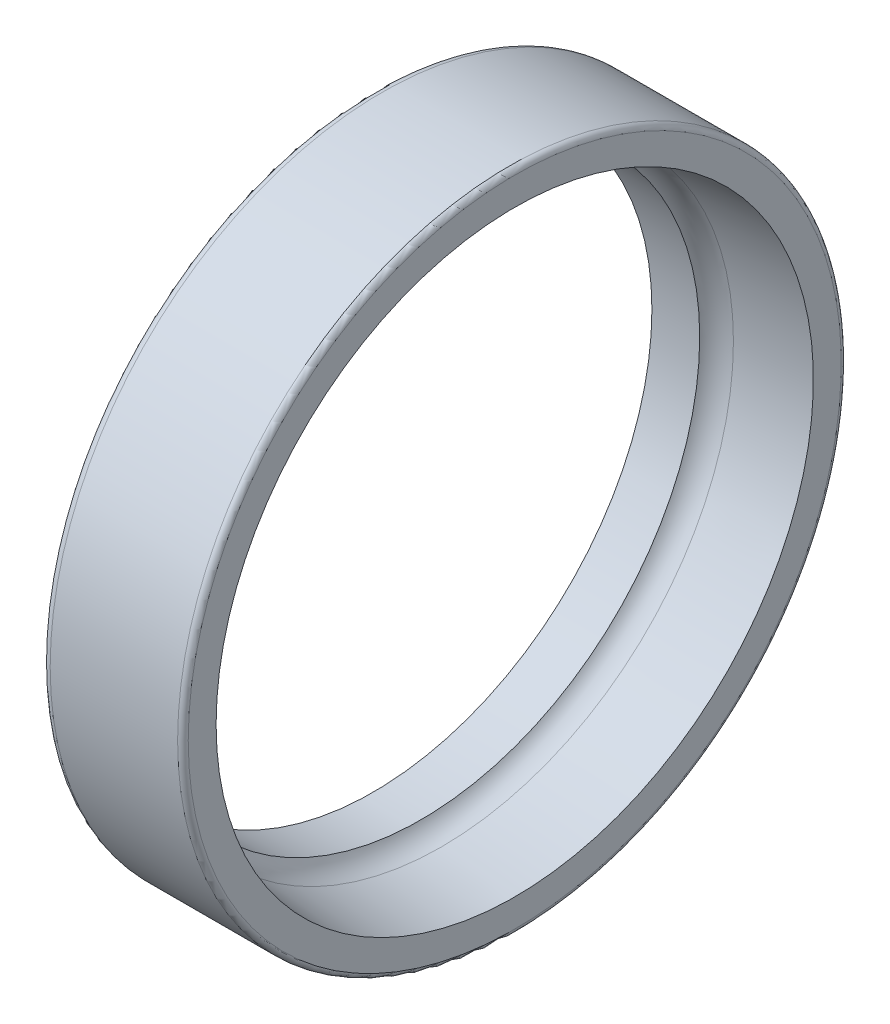
ISO-10303-21;
HEADER;
FILE_DESCRIPTION(('STEP AP214'),'2;1');
FILE_NAME('part.step','',(''),(''),'','','');
FILE_SCHEMA(('AUTOMOTIVE_DESIGN { 1 0 10303 214 1 1 1 1 }'));
ENDSEC;
DATA;
#1=APPLICATION_CONTEXT('core data for automotive mechanical design processes');
#2=APPLICATION_PROTOCOL_DEFINITION('international standard','automotive_design',2000,#1);
#3=PRODUCT_CONTEXT('',#1,'mechanical');
#4=PRODUCT('Part','Part','',(#3));
#5=PRODUCT_RELATED_PRODUCT_CATEGORY('part','',(#4));
#6=PRODUCT_DEFINITION_FORMATION('','',#4);
#7=PRODUCT_DEFINITION_CONTEXT('part definition',#1,'design');
#8=PRODUCT_DEFINITION('design','',#6,#7);
#9=PRODUCT_DEFINITION_SHAPE('','',#8);
#10=(LENGTH_UNIT() NAMED_UNIT(*) SI_UNIT(.MILLI.,.METRE.));
#11=(NAMED_UNIT(*) PLANE_ANGLE_UNIT() SI_UNIT($,.RADIAN.));
#12=(NAMED_UNIT(*) SI_UNIT($,.STERADIAN.) SOLID_ANGLE_UNIT());
#13=UNCERTAINTY_MEASURE_WITH_UNIT(LENGTH_MEASURE(1.E-05),#10,'distance_accuracy_value','');
#14=(GEOMETRIC_REPRESENTATION_CONTEXT(3) GLOBAL_UNCERTAINTY_ASSIGNED_CONTEXT((#13)) GLOBAL_UNIT_ASSIGNED_CONTEXT((#10,
#11,#12)) REPRESENTATION_CONTEXT('',''));
#15=CARTESIAN_POINT('',(0.,0.,0.));
#16=DIRECTION('',(0.,0.,1.));
#17=DIRECTION('',(1.,0.,0.));
#18=AXIS2_PLACEMENT_3D('',#15,#16,#17);
#19=CARTESIAN_POINT('',(0.,36.5,0.));
#20=DIRECTION('',(1.,0.,0.));
#21=DIRECTION('',(0.,0.,-1.));
#22=AXIS2_PLACEMENT_3D('',#19,#20,#21);
#23=PLANE('',#22);
#24=CARTESIAN_POINT('',(0.,0.,0.));
#25=DIRECTION('',(-1.,0.,0.));
#26=DIRECTION('',(0.,0.,1.));
#27=AXIS2_PLACEMENT_3D('',#24,#25,#26);
#28=CIRCLE('',#27,31.5);
#29=CARTESIAN_POINT('',(0.,0.,31.5));
#30=VERTEX_POINT('',#29);
#31=EDGE_CURVE('E59',#30,#30,#28,.T.);
#32=ORIENTED_EDGE('',*,*,#31,.F.);
#33=EDGE_LOOP('',(#32));
#34=FACE_BOUND('',#33,.T.);
#35=CARTESIAN_POINT('',(0.,0.,0.));
#36=DIRECTION('',(-1.,0.,0.));
#37=DIRECTION('',(0.,0.,1.));
#38=AXIS2_PLACEMENT_3D('',#35,#36,#37);
#39=CIRCLE('',#38,36.5);
#40=CARTESIAN_POINT('',(0.,0.,36.5));
#41=VERTEX_POINT('',#40);
#42=EDGE_CURVE('E10',#41,#41,#39,.T.);
#43=ORIENTED_EDGE('',*,*,#42,.T.);
#44=EDGE_LOOP('',(#43));
#45=FACE_BOUND('',#44,.T.);
#46=ADVANCED_FACE('F31',(#34,#45),#23,.F.);
#47=CARTESIAN_POINT('',(0.99999999999922,0.,0.));
#48=DIRECTION('',(-1.,0.,0.));
#49=DIRECTION('',(0.,0.,1.));
#50=AXIS2_PLACEMENT_3D('',#47,#48,#49);
#51=TOROIDAL_SURFACE('',#50,36.5000000000008,0.999999999999219);
#52=ORIENTED_EDGE('',*,*,#42,.F.);
#53=EDGE_LOOP('',(#52));
#54=FACE_BOUND('',#53,.T.);
#55=CARTESIAN_POINT('',(1.,0.,0.));
#56=DIRECTION('',(-1.,0.,0.));
#57=DIRECTION('',(0.,0.,1.));
#58=AXIS2_PLACEMENT_3D('',#55,#56,#57);
#59=CIRCLE('',#58,37.5);
#60=CARTESIAN_POINT('',(1.,0.,37.5));
#61=VERTEX_POINT('',#60);
#62=EDGE_CURVE('E37',#61,#61,#59,.T.);
#63=ORIENTED_EDGE('',*,*,#62,.T.);
#64=EDGE_LOOP('',(#63));
#65=FACE_BOUND('',#64,.T.);
#66=ADVANCED_FACE('F66',(#54,#65),#51,.T.);
#67=CARTESIAN_POINT('',(16.,0.,0.));
#68=DIRECTION('',(-1.,0.,0.));
#69=DIRECTION('',(0.,0.,1.));
#70=AXIS2_PLACEMENT_3D('',#67,#68,#69);
#71=CYLINDRICAL_SURFACE('',#70,37.5);
#72=ORIENTED_EDGE('',*,*,#62,.F.);
#73=EDGE_LOOP('',(#72));
#74=FACE_BOUND('',#73,.T.);
#75=CARTESIAN_POINT('',(15.4,0.,0.));
#76=DIRECTION('',(-1.,0.,0.));
#77=DIRECTION('',(0.,0.,1.));
#78=AXIS2_PLACEMENT_3D('',#75,#76,#77);
#79=CIRCLE('',#78,37.5);
#80=CARTESIAN_POINT('',(15.4,0.,37.5));
#81=VERTEX_POINT('',#80);
#82=EDGE_CURVE('E41',#81,#81,#79,.T.);
#83=ORIENTED_EDGE('',*,*,#82,.T.);
#84=EDGE_LOOP('',(#83));
#85=FACE_BOUND('',#84,.T.);
#86=ADVANCED_FACE('F70',(#74,#85),#71,.T.);
#87=CARTESIAN_POINT('',(15.4000000000002,0.,0.));
#88=DIRECTION('',(-1.,0.,0.));
#89=DIRECTION('',(0.,0.,1.));
#90=AXIS2_PLACEMENT_3D('',#87,#88,#89);
#91=TOROIDAL_SURFACE('',#90,36.9000000000002,0.599999999999765);
#92=ORIENTED_EDGE('',*,*,#82,.F.);
#93=EDGE_LOOP('',(#92));
#94=FACE_BOUND('',#93,.T.);
#95=CARTESIAN_POINT('',(16.,0.,0.));
#96=DIRECTION('',(-1.,0.,0.));
#97=DIRECTION('',(0.,0.,1.));
#98=AXIS2_PLACEMENT_3D('',#95,#96,#97);
#99=CIRCLE('',#98,36.9);
#100=CARTESIAN_POINT('',(16.,0.,36.9));
#101=VERTEX_POINT('',#100);
#102=EDGE_CURVE('E45',#101,#101,#99,.T.);
#103=ORIENTED_EDGE('',*,*,#102,.T.);
#104=EDGE_LOOP('',(#103));
#105=FACE_BOUND('',#104,.T.);
#106=ADVANCED_FACE('F75',(#94,#105),#91,.T.);
#107=CARTESIAN_POINT('',(16.,33.75,0.));
#108=DIRECTION('',(-1.,0.,0.));
#109=DIRECTION('',(0.,0.,1.));
#110=AXIS2_PLACEMENT_3D('',#107,#108,#109);
#111=PLANE('',#110);
#112=ORIENTED_EDGE('',*,*,#102,.F.);
#113=EDGE_LOOP('',(#112));
#114=FACE_BOUND('',#113,.T.);
#115=CARTESIAN_POINT('',(16.,0.,0.));
#116=DIRECTION('',(-1.,0.,0.));
#117=DIRECTION('',(0.,0.,1.));
#118=AXIS2_PLACEMENT_3D('',#115,#116,#117);
#119=CIRCLE('',#118,33.75);
#120=CARTESIAN_POINT('',(16.,0.,33.75));
#121=VERTEX_POINT('',#120);
#122=EDGE_CURVE('E50',#121,#121,#119,.T.);
#123=ORIENTED_EDGE('',*,*,#122,.T.);
#124=EDGE_LOOP('',(#123));
#125=FACE_BOUND('',#124,.T.);
#126=ADVANCED_FACE('F81',(#114,#125),#111,.F.);
#127=CARTESIAN_POINT('',(7.7246842974592,0.,0.));
#128=DIRECTION('',(1.,0.,0.));
#129=DIRECTION('',(0.,0.,-1.));
#130=AXIS2_PLACEMENT_3D('',#127,#128,#129);
#131=CONICAL_SURFACE('',#130,32.98734016542,0.0919012099313217);
#132=ORIENTED_EDGE('',*,*,#122,.F.);
#133=EDGE_LOOP('',(#132));
#134=FACE_BOUND('',#133,.T.);
#135=CARTESIAN_POINT('',(7.7246842974592,0.,0.));
#136=DIRECTION('',(-1.,0.,0.));
#137=DIRECTION('',(0.,0.,1.));
#138=AXIS2_PLACEMENT_3D('',#135,#136,#137);
#139=CIRCLE('',#138,32.98734016542);
#140=CARTESIAN_POINT('',(7.7246842974592,0.,32.98734016542));
#141=VERTEX_POINT('',#140);
#142=EDGE_CURVE('E53',#141,#141,#139,.T.);
#143=ORIENTED_EDGE('',*,*,#142,.T.);
#144=EDGE_LOOP('',(#143));
#145=FACE_BOUND('',#144,.T.);
#146=ADVANCED_FACE('F85',(#134,#145),#131,.F.);
#147=CARTESIAN_POINT('',(7.99999999999684,0.,0.));
#148=DIRECTION('',(-1.,0.,0.));
#149=DIRECTION('',(0.,0.,1.));
#150=AXIS2_PLACEMENT_3D('',#147,#148,#149);
#151=TOROIDAL_SURFACE('',#150,30.000000000004,2.99999999999525);
#152=ORIENTED_EDGE('',*,*,#142,.F.);
#153=EDGE_LOOP('',(#152));
#154=FACE_BOUND('',#153,.T.);
#155=CARTESIAN_POINT('',(5.4019237886467,0.,0.));
#156=DIRECTION('',(-1.,0.,0.));
#157=DIRECTION('',(0.,0.,1.));
#158=AXIS2_PLACEMENT_3D('',#155,#156,#157);
#159=CIRCLE('',#158,31.5);
#160=CARTESIAN_POINT('',(5.4019237886467,0.,31.5));
#161=VERTEX_POINT('',#160);
#162=EDGE_CURVE('E56',#161,#161,#159,.T.);
#163=ORIENTED_EDGE('',*,*,#162,.T.);
#164=EDGE_LOOP('',(#163));
#165=FACE_BOUND('',#164,.T.);
#166=ADVANCED_FACE('F89',(#154,#165),#151,.F.);
#167=CARTESIAN_POINT('',(16.,0.,0.));
#168=DIRECTION('',(-1.,0.,0.));
#169=DIRECTION('',(0.,0.,1.));
#170=AXIS2_PLACEMENT_3D('',#167,#168,#169);
#171=CYLINDRICAL_SURFACE('',#170,31.5);
#172=ORIENTED_EDGE('',*,*,#162,.F.);
#173=EDGE_LOOP('',(#172));
#174=FACE_BOUND('',#173,.T.);
#175=ORIENTED_EDGE('',*,*,#31,.T.);
#176=EDGE_LOOP('',(#175));
#177=FACE_BOUND('',#176,.T.);
#178=ADVANCED_FACE('F63',(#174,#177),#171,.F.);
#179=CLOSED_SHELL('',(#46,#66,#86,#106,#126,#146,#166,#178));
#180=MANIFOLD_SOLID_BREP('B2',#179);
#181=ADVANCED_BREP_SHAPE_REPRESENTATION('',(#18,#180),#14);
#182=SHAPE_DEFINITION_REPRESENTATION(#9,#181);
ENDSEC;
END-ISO-10303-21;
